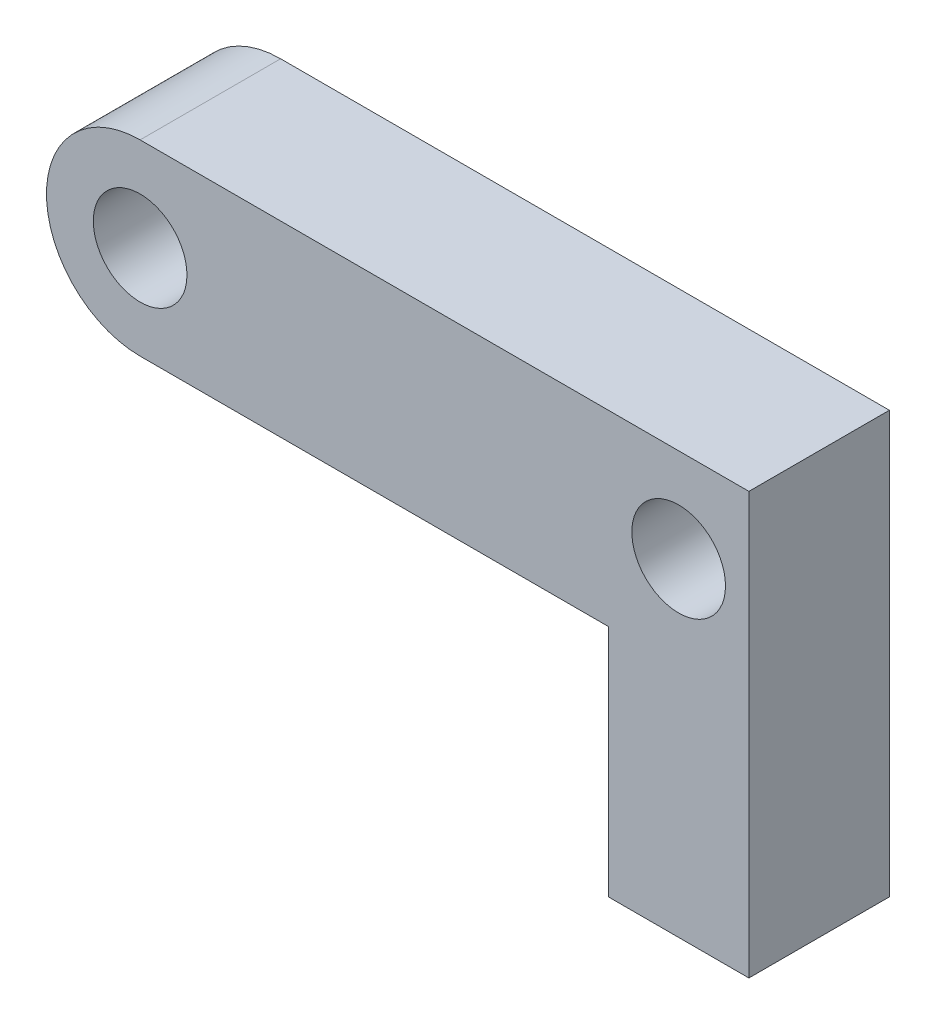
ISO-10303-21;
HEADER;
FILE_DESCRIPTION(('STEP AP214'),'2;1');
FILE_NAME('part.step','',(''),(''),'','','');
FILE_SCHEMA(('AUTOMOTIVE_DESIGN { 1 0 10303 214 1 1 1 1 }'));
ENDSEC;
DATA;
#1=APPLICATION_CONTEXT('core data for automotive mechanical design processes');
#2=APPLICATION_PROTOCOL_DEFINITION('international standard','automotive_design',2000,#1);
#3=PRODUCT_CONTEXT('',#1,'mechanical');
#4=PRODUCT('Part','Part','',(#3));
#5=PRODUCT_RELATED_PRODUCT_CATEGORY('part','',(#4));
#6=PRODUCT_DEFINITION_FORMATION('','',#4);
#7=PRODUCT_DEFINITION_CONTEXT('part definition',#1,'design');
#8=PRODUCT_DEFINITION('design','',#6,#7);
#9=PRODUCT_DEFINITION_SHAPE('','',#8);
#10=(LENGTH_UNIT() NAMED_UNIT(*) SI_UNIT(.MILLI.,.METRE.));
#11=(NAMED_UNIT(*) PLANE_ANGLE_UNIT() SI_UNIT($,.RADIAN.));
#12=(NAMED_UNIT(*) SI_UNIT($,.STERADIAN.) SOLID_ANGLE_UNIT());
#13=UNCERTAINTY_MEASURE_WITH_UNIT(LENGTH_MEASURE(1.E-05),#10,'distance_accuracy_value','');
#14=(GEOMETRIC_REPRESENTATION_CONTEXT(3) GLOBAL_UNCERTAINTY_ASSIGNED_CONTEXT((#13)) GLOBAL_UNIT_ASSIGNED_CONTEXT((#10,
#11,#12)) REPRESENTATION_CONTEXT('',''));
#15=CARTESIAN_POINT('',(0.,0.,0.));
#16=DIRECTION('',(0.,0.,1.));
#17=DIRECTION('',(1.,0.,0.));
#18=AXIS2_PLACEMENT_3D('',#15,#16,#17);
#19=CARTESIAN_POINT('',(0.,0.,30.));
#20=DIRECTION('',(0.,0.,-1.));
#21=DIRECTION('',(-1.,0.,0.));
#22=AXIS2_PLACEMENT_3D('',#19,#20,#21);
#23=CYLINDRICAL_SURFACE('',#22,20.);
#24=CARTESIAN_POINT('',(0.,0.,0.));
#25=DIRECTION('',(0.,0.,1.));
#26=DIRECTION('',(1.,0.,0.));
#27=AXIS2_PLACEMENT_3D('',#24,#25,#26);
#28=CIRCLE('',#27,20.);
#29=CARTESIAN_POINT('',(0.,20.,0.));
#30=VERTEX_POINT('',#29);
#31=CARTESIAN_POINT('',(0.,-20.,0.));
#32=VERTEX_POINT('',#31);
#33=EDGE_CURVE('E125',#30,#32,#28,.T.);
#34=ORIENTED_EDGE('',*,*,#33,.T.);
#35=DIRECTION('',(0.,0.,-1.));
#36=VECTOR('',#35,1.);
#37=CARTESIAN_POINT('',(0.,-20.,30.));
#38=LINE('',#37,#36);
#39=CARTESIAN_POINT('',(0.,-20.,30.));
#40=VERTEX_POINT('',#39);
#41=EDGE_CURVE('E11',#40,#32,#38,.T.);
#42=ORIENTED_EDGE('',*,*,#41,.F.);
#43=CARTESIAN_POINT('',(0.,0.,30.));
#44=DIRECTION('',(0.,0.,1.));
#45=DIRECTION('',(1.,0.,0.));
#46=AXIS2_PLACEMENT_3D('',#43,#44,#45);
#47=CIRCLE('',#46,20.);
#48=CARTESIAN_POINT('',(0.,20.,30.));
#49=VERTEX_POINT('',#48);
#50=EDGE_CURVE('E131',#49,#40,#47,.T.);
#51=ORIENTED_EDGE('',*,*,#50,.F.);
#52=DIRECTION('',(0.,0.,-1.));
#53=VECTOR('',#52,1.);
#54=CARTESIAN_POINT('',(0.,20.,30.));
#55=LINE('',#54,#53);
#56=EDGE_CURVE('E116',#49,#30,#55,.T.);
#57=ORIENTED_EDGE('',*,*,#56,.T.);
#58=EDGE_LOOP('',(#34,#42,#51,#57));
#59=FACE_BOUND('',#58,.T.);
#60=ADVANCED_FACE('F39',(#59),#23,.T.);
#61=CARTESIAN_POINT('',(0.,-20.,30.));
#62=DIRECTION('',(0.,1.,0.));
#63=DIRECTION('',(-1.,0.,0.));
#64=AXIS2_PLACEMENT_3D('',#61,#62,#63);
#65=PLANE('',#64);
#66=DIRECTION('',(1.,0.,0.));
#67=VECTOR('',#66,1.);
#68=CARTESIAN_POINT('',(0.,-20.,0.));
#69=LINE('',#68,#67);
#70=CARTESIAN_POINT('',(100.,-20.,0.));
#71=VERTEX_POINT('',#70);
#72=EDGE_CURVE('E127',#32,#71,#69,.T.);
#73=ORIENTED_EDGE('',*,*,#72,.T.);
#74=DIRECTION('',(0.,0.,-1.));
#75=VECTOR('',#74,1.);
#76=CARTESIAN_POINT('',(100.,-20.,30.));
#77=LINE('',#76,#75);
#78=CARTESIAN_POINT('',(100.,-20.,30.));
#79=VERTEX_POINT('',#78);
#80=EDGE_CURVE('E50',#79,#71,#77,.T.);
#81=ORIENTED_EDGE('',*,*,#80,.F.);
#82=DIRECTION('',(1.,0.,0.));
#83=VECTOR('',#82,1.);
#84=CARTESIAN_POINT('',(0.,-20.,30.));
#85=LINE('',#84,#83);
#86=EDGE_CURVE('E95',#40,#79,#85,.T.);
#87=ORIENTED_EDGE('',*,*,#86,.F.);
#88=ORIENTED_EDGE('',*,*,#41,.T.);
#89=EDGE_LOOP('',(#73,#81,#87,#88));
#90=FACE_BOUND('',#89,.T.);
#91=ADVANCED_FACE('F159',(#90),#65,.F.);
#92=CARTESIAN_POINT('',(100.,-20.,30.));
#93=DIRECTION('',(1.,0.,0.));
#94=DIRECTION('',(0.,0.,-1.));
#95=AXIS2_PLACEMENT_3D('',#92,#93,#94);
#96=PLANE('',#95);
#97=DIRECTION('',(0.,-1.,0.));
#98=VECTOR('',#97,1.);
#99=CARTESIAN_POINT('',(100.,-20.,0.));
#100=LINE('',#99,#98);
#101=CARTESIAN_POINT('',(100.,-70.,0.));
#102=VERTEX_POINT('',#101);
#103=EDGE_CURVE('E129',#71,#102,#100,.T.);
#104=ORIENTED_EDGE('',*,*,#103,.T.);
#105=DIRECTION('',(0.,0.,-1.));
#106=VECTOR('',#105,1.);
#107=CARTESIAN_POINT('',(100.,-70.,30.));
#108=LINE('',#107,#106);
#109=CARTESIAN_POINT('',(100.,-70.,30.));
#110=VERTEX_POINT('',#109);
#111=EDGE_CURVE('E111',#110,#102,#108,.T.);
#112=ORIENTED_EDGE('',*,*,#111,.F.);
#113=DIRECTION('',(0.,-1.,0.));
#114=VECTOR('',#113,1.);
#115=CARTESIAN_POINT('',(100.,-20.,30.));
#116=LINE('',#115,#114);
#117=EDGE_CURVE('E104',#79,#110,#116,.T.);
#118=ORIENTED_EDGE('',*,*,#117,.F.);
#119=ORIENTED_EDGE('',*,*,#80,.T.);
#120=EDGE_LOOP('',(#104,#112,#118,#119));
#121=FACE_BOUND('',#120,.T.);
#122=ADVANCED_FACE('F137',(#121),#96,.F.);
#123=CARTESIAN_POINT('',(100.,-70.,30.));
#124=DIRECTION('',(0.,1.,0.));
#125=DIRECTION('',(0.,0.,1.));
#126=AXIS2_PLACEMENT_3D('',#123,#124,#125);
#127=PLANE('',#126);
#128=CARTESIAN_POINT('',(115.,-70.,15.));
#129=DIRECTION('',(0.,-1.,0.));
#130=DIRECTION('',(0.,0.,-1.));
#131=AXIS2_PLACEMENT_3D('',#128,#129,#130);
#132=CIRCLE('',#131,8.);
#133=CARTESIAN_POINT('',(115.,-70.,7.));
#134=VERTEX_POINT('',#133);
#135=EDGE_CURVE('E173',#134,#134,#132,.T.);
#136=ORIENTED_EDGE('',*,*,#135,.F.);
#137=EDGE_LOOP('',(#136));
#138=FACE_BOUND('',#137,.T.);
#139=DIRECTION('',(1.,0.,0.));
#140=VECTOR('',#139,1.);
#141=CARTESIAN_POINT('',(100.,-70.,0.));
#142=LINE('',#141,#140);
#143=CARTESIAN_POINT('',(130.,-70.,0.));
#144=VERTEX_POINT('',#143);
#145=EDGE_CURVE('E114',#102,#144,#142,.T.);
#146=ORIENTED_EDGE('',*,*,#145,.T.);
#147=DIRECTION('',(0.,0.,-1.));
#148=VECTOR('',#147,1.);
#149=CARTESIAN_POINT('',(130.,-70.,30.));
#150=LINE('',#149,#148);
#151=CARTESIAN_POINT('',(130.,-70.,30.));
#152=VERTEX_POINT('',#151);
#153=EDGE_CURVE('E109',#152,#144,#150,.T.);
#154=ORIENTED_EDGE('',*,*,#153,.F.);
#155=DIRECTION('',(1.,0.,0.));
#156=VECTOR('',#155,1.);
#157=CARTESIAN_POINT('',(100.,-70.,30.));
#158=LINE('',#157,#156);
#159=EDGE_CURVE('E97',#110,#152,#158,.T.);
#160=ORIENTED_EDGE('',*,*,#159,.F.);
#161=ORIENTED_EDGE('',*,*,#111,.T.);
#162=EDGE_LOOP('',(#146,#154,#160,#161));
#163=FACE_BOUND('',#162,.T.);
#164=ADVANCED_FACE('F112',(#138,#163),#127,.F.);
#165=CARTESIAN_POINT('',(130.,20.,30.));
#166=DIRECTION('',(-1.,0.,0.));
#167=DIRECTION('',(0.,0.,1.));
#168=AXIS2_PLACEMENT_3D('',#165,#166,#167);
#169=PLANE('',#168);
#170=DIRECTION('',(0.,1.,0.));
#171=VECTOR('',#170,1.);
#172=CARTESIAN_POINT('',(130.,20.,0.));
#173=LINE('',#172,#171);
#174=CARTESIAN_POINT('',(130.,20.,0.));
#175=VERTEX_POINT('',#174);
#176=EDGE_CURVE('E79',#144,#175,#173,.T.);
#177=ORIENTED_EDGE('',*,*,#176,.T.);
#178=DIRECTION('',(0.,0.,-1.));
#179=VECTOR('',#178,1.);
#180=CARTESIAN_POINT('',(130.,20.,30.));
#181=LINE('',#180,#179);
#182=CARTESIAN_POINT('',(130.,20.,30.));
#183=VERTEX_POINT('',#182);
#184=EDGE_CURVE('E113',#183,#175,#181,.T.);
#185=ORIENTED_EDGE('',*,*,#184,.F.);
#186=DIRECTION('',(0.,1.,0.));
#187=VECTOR('',#186,1.);
#188=CARTESIAN_POINT('',(130.,20.,30.));
#189=LINE('',#188,#187);
#190=EDGE_CURVE('E103',#152,#183,#189,.T.);
#191=ORIENTED_EDGE('',*,*,#190,.F.);
#192=ORIENTED_EDGE('',*,*,#153,.T.);
#193=EDGE_LOOP('',(#177,#185,#191,#192));
#194=FACE_BOUND('',#193,.T.);
#195=ADVANCED_FACE('F120',(#194),#169,.F.);
#196=CARTESIAN_POINT('',(0.,20.,30.));
#197=DIRECTION('',(0.,-1.,0.));
#198=DIRECTION('',(1.,0.,0.));
#199=AXIS2_PLACEMENT_3D('',#196,#197,#198);
#200=PLANE('',#199);
#201=DIRECTION('',(-1.,0.,0.));
#202=VECTOR('',#201,1.);
#203=CARTESIAN_POINT('',(0.,20.,0.));
#204=LINE('',#203,#202);
#205=EDGE_CURVE('E83',#175,#30,#204,.T.);
#206=ORIENTED_EDGE('',*,*,#205,.T.);
#207=ORIENTED_EDGE('',*,*,#56,.F.);
#208=DIRECTION('',(-1.,0.,0.));
#209=VECTOR('',#208,1.);
#210=CARTESIAN_POINT('',(0.,20.,30.));
#211=LINE('',#210,#209);
#212=EDGE_CURVE('E54',#183,#49,#211,.T.);
#213=ORIENTED_EDGE('',*,*,#212,.F.);
#214=ORIENTED_EDGE('',*,*,#184,.T.);
#215=EDGE_LOOP('',(#206,#207,#213,#214));
#216=FACE_BOUND('',#215,.T.);
#217=ADVANCED_FACE('F150',(#216),#200,.F.);
#218=CARTESIAN_POINT('',(0.,0.,30.));
#219=DIRECTION('',(0.,0.,1.));
#220=DIRECTION('',(1.,0.,0.));
#221=AXIS2_PLACEMENT_3D('',#218,#219,#220);
#222=PLANE('',#221);
#223=CARTESIAN_POINT('',(0.,0.,30.));
#224=DIRECTION('',(0.,0.,1.));
#225=DIRECTION('',(1.,0.,0.));
#226=AXIS2_PLACEMENT_3D('',#223,#224,#225);
#227=CIRCLE('',#226,10.);
#228=CARTESIAN_POINT('',(10.,0.,30.));
#229=VERTEX_POINT('',#228);
#230=EDGE_CURVE('E185',#229,#229,#227,.T.);
#231=ORIENTED_EDGE('',*,*,#230,.F.);
#232=EDGE_LOOP('',(#231));
#233=FACE_BOUND('',#232,.T.);
#234=CARTESIAN_POINT('',(115.,0.,30.));
#235=DIRECTION('',(0.,0.,1.));
#236=DIRECTION('',(1.,0.,0.));
#237=AXIS2_PLACEMENT_3D('',#234,#235,#236);
#238=CIRCLE('',#237,9.99999999999999);
#239=CARTESIAN_POINT('',(125.,0.,30.));
#240=VERTEX_POINT('',#239);
#241=EDGE_CURVE('E188',#240,#240,#238,.T.);
#242=ORIENTED_EDGE('',*,*,#241,.F.);
#243=EDGE_LOOP('',(#242));
#244=FACE_BOUND('',#243,.T.);
#245=ORIENTED_EDGE('',*,*,#50,.T.);
#246=ORIENTED_EDGE('',*,*,#86,.T.);
#247=ORIENTED_EDGE('',*,*,#117,.T.);
#248=ORIENTED_EDGE('',*,*,#159,.T.);
#249=ORIENTED_EDGE('',*,*,#190,.T.);
#250=ORIENTED_EDGE('',*,*,#212,.T.);
#251=EDGE_LOOP('',(#245,#246,#247,#248,#249,#250));
#252=FACE_BOUND('',#251,.T.);
#253=ADVANCED_FACE('F101',(#233,#244,#252),#222,.T.);
#254=CARTESIAN_POINT('',(0.,0.,0.));
#255=DIRECTION('',(0.,0.,1.));
#256=DIRECTION('',(1.,0.,0.));
#257=AXIS2_PLACEMENT_3D('',#254,#255,#256);
#258=PLANE('',#257);
#259=CARTESIAN_POINT('',(0.,0.,0.));
#260=DIRECTION('',(0.,0.,1.));
#261=DIRECTION('',(1.,0.,0.));
#262=AXIS2_PLACEMENT_3D('',#259,#260,#261);
#263=CIRCLE('',#262,10.);
#264=CARTESIAN_POINT('',(10.,0.,0.));
#265=VERTEX_POINT('',#264);
#266=EDGE_CURVE('E176',#265,#265,#263,.T.);
#267=ORIENTED_EDGE('',*,*,#266,.T.);
#268=EDGE_LOOP('',(#267));
#269=FACE_BOUND('',#268,.T.);
#270=CARTESIAN_POINT('',(115.,0.,0.));
#271=DIRECTION('',(0.,0.,1.));
#272=DIRECTION('',(1.,0.,0.));
#273=AXIS2_PLACEMENT_3D('',#270,#271,#272);
#274=CIRCLE('',#273,9.99999999999999);
#275=CARTESIAN_POINT('',(125.,0.,0.));
#276=VERTEX_POINT('',#275);
#277=EDGE_CURVE('E190',#276,#276,#274,.T.);
#278=ORIENTED_EDGE('',*,*,#277,.T.);
#279=EDGE_LOOP('',(#278));
#280=FACE_BOUND('',#279,.T.);
#281=ORIENTED_EDGE('',*,*,#33,.F.);
#282=ORIENTED_EDGE('',*,*,#205,.F.);
#283=ORIENTED_EDGE('',*,*,#176,.F.);
#284=ORIENTED_EDGE('',*,*,#145,.F.);
#285=ORIENTED_EDGE('',*,*,#103,.F.);
#286=ORIENTED_EDGE('',*,*,#72,.F.);
#287=EDGE_LOOP('',(#281,#282,#283,#284,#285,#286));
#288=FACE_BOUND('',#287,.T.);
#289=ADVANCED_FACE('F141',(#269,#280,#288),#258,.F.);
#290=CARTESIAN_POINT('',(115.,-40.,15.));
#291=DIRECTION('',(0.,-1.,0.));
#292=DIRECTION('',(0.,0.,-1.));
#293=AXIS2_PLACEMENT_3D('',#290,#291,#292);
#294=CYLINDRICAL_SURFACE('',#293,8.);
#295=CARTESIAN_POINT('',(115.,-40.,15.));
#296=DIRECTION('',(0.,-1.,0.));
#297=DIRECTION('',(0.,0.,-1.));
#298=AXIS2_PLACEMENT_3D('',#295,#296,#297);
#299=CIRCLE('',#298,8.);
#300=CARTESIAN_POINT('',(115.,-40.,7.));
#301=VERTEX_POINT('',#300);
#302=EDGE_CURVE('E130',#301,#301,#299,.T.);
#303=ORIENTED_EDGE('',*,*,#302,.F.);
#304=EDGE_LOOP('',(#303));
#305=FACE_BOUND('',#304,.T.);
#306=ORIENTED_EDGE('',*,*,#135,.T.);
#307=EDGE_LOOP('',(#306));
#308=FACE_BOUND('',#307,.T.);
#309=ADVANCED_FACE('F215',(#305,#308),#294,.F.);
#310=CARTESIAN_POINT('',(115.,-40.,15.));
#311=DIRECTION('',(0.,-1.,0.));
#312=DIRECTION('',(0.,0.,-1.));
#313=AXIS2_PLACEMENT_3D('',#310,#311,#312);
#314=PLANE('',#313);
#315=ORIENTED_EDGE('',*,*,#302,.T.);
#316=EDGE_LOOP('',(#315));
#317=FACE_BOUND('',#316,.T.);
#318=ADVANCED_FACE('F205',(#317),#314,.T.);
#319=CARTESIAN_POINT('',(115.,0.,0.));
#320=DIRECTION('',(0.,0.,1.));
#321=DIRECTION('',(1.,0.,0.));
#322=AXIS2_PLACEMENT_3D('',#319,#320,#321);
#323=CYLINDRICAL_SURFACE('',#322,9.99999999999999);
#324=ORIENTED_EDGE('',*,*,#277,.F.);
#325=EDGE_LOOP('',(#324));
#326=FACE_BOUND('',#325,.T.);
#327=ORIENTED_EDGE('',*,*,#241,.T.);
#328=EDGE_LOOP('',(#327));
#329=FACE_BOUND('',#328,.T.);
#330=ADVANCED_FACE('F199',(#326,#329),#323,.F.);
#331=CARTESIAN_POINT('',(0.,0.,0.));
#332=DIRECTION('',(0.,0.,1.));
#333=DIRECTION('',(1.,0.,0.));
#334=AXIS2_PLACEMENT_3D('',#331,#332,#333);
#335=CYLINDRICAL_SURFACE('',#334,10.);
#336=ORIENTED_EDGE('',*,*,#266,.F.);
#337=EDGE_LOOP('',(#336));
#338=FACE_BOUND('',#337,.T.);
#339=ORIENTED_EDGE('',*,*,#230,.T.);
#340=EDGE_LOOP('',(#339));
#341=FACE_BOUND('',#340,.T.);
#342=ADVANCED_FACE('F198',(#338,#341),#335,.F.);
#343=CLOSED_SHELL('',(#60,#91,#122,#164,#195,#217,#253,#289,#309,#318,#330,#342));
#344=MANIFOLD_SOLID_BREP('B2',#343);
#345=ADVANCED_BREP_SHAPE_REPRESENTATION('',(#18,#344),#14);
#346=SHAPE_DEFINITION_REPRESENTATION(#9,#345);
ENDSEC;
END-ISO-10303-21;
